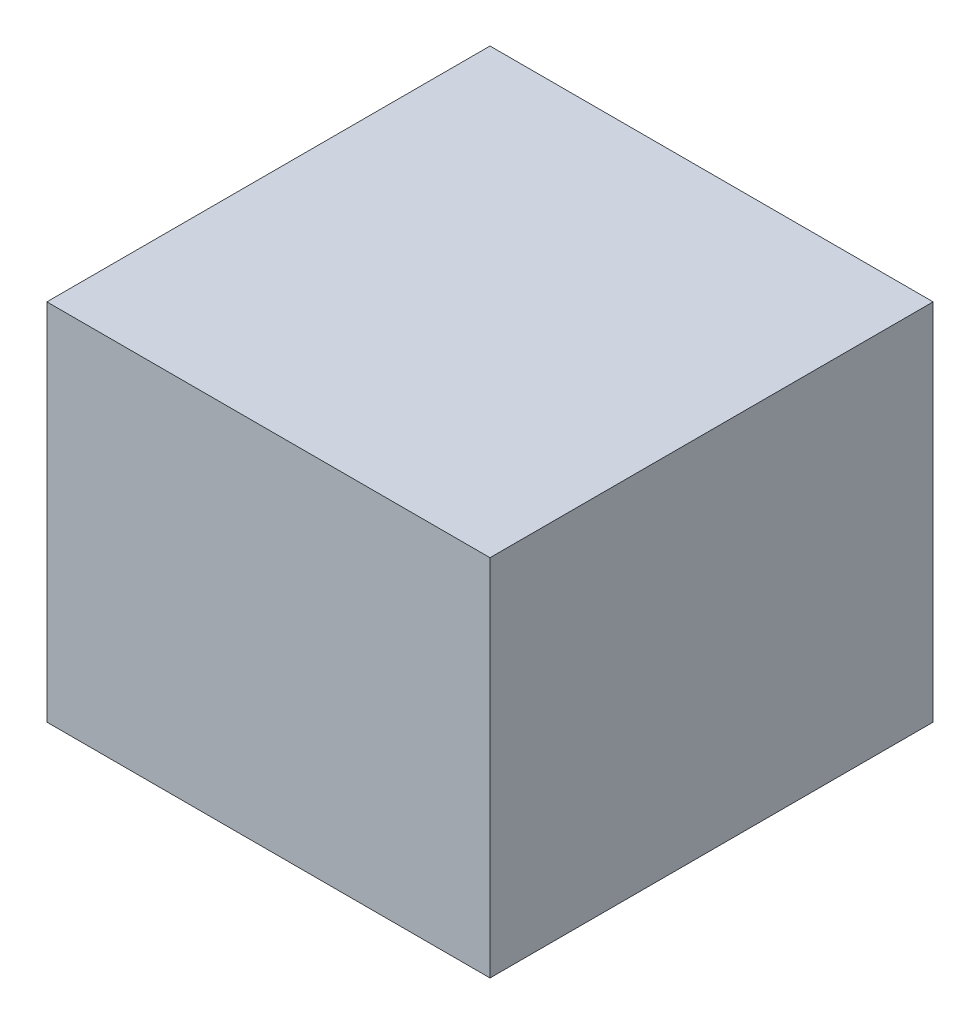
ISO-10303-21;
HEADER;
FILE_DESCRIPTION(('STEP AP214'),'2;1');
FILE_NAME('part.step','',(''),(''),'','','');
FILE_SCHEMA(('AUTOMOTIVE_DESIGN { 1 0 10303 214 1 1 1 1 }'));
ENDSEC;
DATA;
#1=APPLICATION_CONTEXT('core data for automotive mechanical design processes');
#2=APPLICATION_PROTOCOL_DEFINITION('international standard','automotive_design',2000,#1);
#3=PRODUCT_CONTEXT('',#1,'mechanical');
#4=PRODUCT('Part','Part','',(#3));
#5=PRODUCT_RELATED_PRODUCT_CATEGORY('part','',(#4));
#6=PRODUCT_DEFINITION_FORMATION('','',#4);
#7=PRODUCT_DEFINITION_CONTEXT('part definition',#1,'design');
#8=PRODUCT_DEFINITION('design','',#6,#7);
#9=PRODUCT_DEFINITION_SHAPE('','',#8);
#10=(LENGTH_UNIT() NAMED_UNIT(*) SI_UNIT(.MILLI.,.METRE.));
#11=(NAMED_UNIT(*) PLANE_ANGLE_UNIT() SI_UNIT($,.RADIAN.));
#12=(NAMED_UNIT(*) SI_UNIT($,.STERADIAN.) SOLID_ANGLE_UNIT());
#13=UNCERTAINTY_MEASURE_WITH_UNIT(LENGTH_MEASURE(1.E-05),#10,'distance_accuracy_value','');
#14=(GEOMETRIC_REPRESENTATION_CONTEXT(3) GLOBAL_UNCERTAINTY_ASSIGNED_CONTEXT((#13)) GLOBAL_UNIT_ASSIGNED_CONTEXT((#10,
#11,#12)) REPRESENTATION_CONTEXT('',''));
#15=CARTESIAN_POINT('',(0.,0.,0.));
#16=DIRECTION('',(0.,0.,1.));
#17=DIRECTION('',(1.,0.,0.));
#18=AXIS2_PLACEMENT_3D('',#15,#16,#17);
#19=CARTESIAN_POINT('',(70.,57.5,-70.));
#20=DIRECTION('',(-1.,0.,0.));
#21=DIRECTION('',(0.,0.,1.));
#22=AXIS2_PLACEMENT_3D('',#19,#20,#21);
#23=PLANE('',#22);
#24=DIRECTION('',(0.,0.,-1.));
#25=VECTOR('',#24,1.);
#26=CARTESIAN_POINT('',(70.,-57.5,-70.));
#27=LINE('',#26,#25);
#28=CARTESIAN_POINT('',(70.,-57.5,70.));
#29=VERTEX_POINT('',#28);
#30=CARTESIAN_POINT('',(70.,-57.5,-70.));
#31=VERTEX_POINT('',#30);
#32=EDGE_CURVE('E99',#29,#31,#27,.T.);
#33=ORIENTED_EDGE('',*,*,#32,.T.);
#34=DIRECTION('',(0.,-1.,0.));
#35=VECTOR('',#34,1.);
#36=CARTESIAN_POINT('',(70.,57.5,-70.));
#37=LINE('',#36,#35);
#38=CARTESIAN_POINT('',(70.,57.5,-70.));
#39=VERTEX_POINT('',#38);
#40=EDGE_CURVE('E11',#39,#31,#37,.T.);
#41=ORIENTED_EDGE('',*,*,#40,.F.);
#42=DIRECTION('',(0.,0.,-1.));
#43=VECTOR('',#42,1.);
#44=CARTESIAN_POINT('',(70.,57.5,-70.));
#45=LINE('',#44,#43);
#46=CARTESIAN_POINT('',(70.,57.5,70.));
#47=VERTEX_POINT('',#46);
#48=EDGE_CURVE('E87',#47,#39,#45,.T.);
#49=ORIENTED_EDGE('',*,*,#48,.F.);
#50=DIRECTION('',(0.,-1.,0.));
#51=VECTOR('',#50,1.);
#52=CARTESIAN_POINT('',(70.,57.5,70.));
#53=LINE('',#52,#51);
#54=EDGE_CURVE('E95',#47,#29,#53,.T.);
#55=ORIENTED_EDGE('',*,*,#54,.T.);
#56=EDGE_LOOP('',(#33,#41,#49,#55));
#57=FACE_BOUND('',#56,.T.);
#58=ADVANCED_FACE('F36',(#57),#23,.F.);
#59=CARTESIAN_POINT('',(-70.,57.5,-70.));
#60=DIRECTION('',(0.,0.,1.));
#61=DIRECTION('',(1.,0.,0.));
#62=AXIS2_PLACEMENT_3D('',#59,#60,#61);
#63=PLANE('',#62);
#64=DIRECTION('',(-1.,0.,0.));
#65=VECTOR('',#64,1.);
#66=CARTESIAN_POINT('',(-70.,-57.5,-70.));
#67=LINE('',#66,#65);
#68=CARTESIAN_POINT('',(-70.,-57.5,-70.));
#69=VERTEX_POINT('',#68);
#70=EDGE_CURVE('E91',#31,#69,#67,.T.);
#71=ORIENTED_EDGE('',*,*,#70,.T.);
#72=DIRECTION('',(0.,-1.,0.));
#73=VECTOR('',#72,1.);
#74=CARTESIAN_POINT('',(-70.,57.5,-70.));
#75=LINE('',#74,#73);
#76=CARTESIAN_POINT('',(-70.,57.5,-70.));
#77=VERTEX_POINT('',#76);
#78=EDGE_CURVE('E44',#77,#69,#75,.T.);
#79=ORIENTED_EDGE('',*,*,#78,.F.);
#80=DIRECTION('',(-1.,0.,0.));
#81=VECTOR('',#80,1.);
#82=CARTESIAN_POINT('',(-70.,57.5,-70.));
#83=LINE('',#82,#81);
#84=EDGE_CURVE('E82',#39,#77,#83,.T.);
#85=ORIENTED_EDGE('',*,*,#84,.F.);
#86=ORIENTED_EDGE('',*,*,#40,.T.);
#87=EDGE_LOOP('',(#71,#79,#85,#86));
#88=FACE_BOUND('',#87,.T.);
#89=ADVANCED_FACE('F90',(#88),#63,.F.);
#90=CARTESIAN_POINT('',(-70.,57.5,-70.));
#91=DIRECTION('',(1.,0.,0.));
#92=DIRECTION('',(0.,0.,-1.));
#93=AXIS2_PLACEMENT_3D('',#90,#91,#92);
#94=PLANE('',#93);
#95=DIRECTION('',(0.,0.,1.));
#96=VECTOR('',#95,1.);
#97=CARTESIAN_POINT('',(-70.,-57.5,-70.));
#98=LINE('',#97,#96);
#99=CARTESIAN_POINT('',(-70.,-57.5,70.));
#100=VERTEX_POINT('',#99);
#101=EDGE_CURVE('E69',#69,#100,#98,.T.);
#102=ORIENTED_EDGE('',*,*,#101,.T.);
#103=DIRECTION('',(0.,-1.,0.));
#104=VECTOR('',#103,1.);
#105=CARTESIAN_POINT('',(-70.,57.5,70.));
#106=LINE('',#105,#104);
#107=CARTESIAN_POINT('',(-70.,57.5,70.));
#108=VERTEX_POINT('',#107);
#109=EDGE_CURVE('E92',#108,#100,#106,.T.);
#110=ORIENTED_EDGE('',*,*,#109,.F.);
#111=DIRECTION('',(0.,0.,1.));
#112=VECTOR('',#111,1.);
#113=CARTESIAN_POINT('',(-70.,57.5,-70.));
#114=LINE('',#113,#112);
#115=EDGE_CURVE('E85',#77,#108,#114,.T.);
#116=ORIENTED_EDGE('',*,*,#115,.F.);
#117=ORIENTED_EDGE('',*,*,#78,.T.);
#118=EDGE_LOOP('',(#102,#110,#116,#117));
#119=FACE_BOUND('',#118,.T.);
#120=ADVANCED_FACE('F93',(#119),#94,.F.);
#121=CARTESIAN_POINT('',(-70.,57.5,70.));
#122=DIRECTION('',(0.,0.,-1.));
#123=DIRECTION('',(-1.,0.,0.));
#124=AXIS2_PLACEMENT_3D('',#121,#122,#123);
#125=PLANE('',#124);
#126=DIRECTION('',(1.,0.,0.));
#127=VECTOR('',#126,1.);
#128=CARTESIAN_POINT('',(-70.,-57.5,70.));
#129=LINE('',#128,#127);
#130=EDGE_CURVE('E75',#100,#29,#129,.T.);
#131=ORIENTED_EDGE('',*,*,#130,.T.);
#132=ORIENTED_EDGE('',*,*,#54,.F.);
#133=DIRECTION('',(1.,0.,0.));
#134=VECTOR('',#133,1.);
#135=CARTESIAN_POINT('',(-70.,57.5,70.));
#136=LINE('',#135,#134);
#137=EDGE_CURVE('E52',#108,#47,#136,.T.);
#138=ORIENTED_EDGE('',*,*,#137,.F.);
#139=ORIENTED_EDGE('',*,*,#109,.T.);
#140=EDGE_LOOP('',(#131,#132,#138,#139));
#141=FACE_BOUND('',#140,.T.);
#142=ADVANCED_FACE('F106',(#141),#125,.F.);
#143=CARTESIAN_POINT('',(0.,57.5,0.));
#144=DIRECTION('',(0.,1.,0.));
#145=DIRECTION('',(0.,0.,1.));
#146=AXIS2_PLACEMENT_3D('',#143,#144,#145);
#147=PLANE('',#146);
#148=ORIENTED_EDGE('',*,*,#48,.T.);
#149=ORIENTED_EDGE('',*,*,#84,.T.);
#150=ORIENTED_EDGE('',*,*,#115,.T.);
#151=ORIENTED_EDGE('',*,*,#137,.T.);
#152=EDGE_LOOP('',(#148,#149,#150,#151));
#153=FACE_BOUND('',#152,.T.);
#154=ADVANCED_FACE('F83',(#153),#147,.T.);
#155=CARTESIAN_POINT('',(0.,-57.5,0.));
#156=DIRECTION('',(0.,1.,0.));
#157=DIRECTION('',(0.,0.,1.));
#158=AXIS2_PLACEMENT_3D('',#155,#156,#157);
#159=PLANE('',#158);
#160=ORIENTED_EDGE('',*,*,#32,.F.);
#161=ORIENTED_EDGE('',*,*,#130,.F.);
#162=ORIENTED_EDGE('',*,*,#101,.F.);
#163=ORIENTED_EDGE('',*,*,#70,.F.);
#164=EDGE_LOOP('',(#160,#161,#162,#163));
#165=FACE_BOUND('',#164,.T.);
#166=ADVANCED_FACE('F109',(#165),#159,.F.);
#167=CLOSED_SHELL('',(#58,#89,#120,#142,#154,#166));
#168=MANIFOLD_SOLID_BREP('B2',#167);
#169=ADVANCED_BREP_SHAPE_REPRESENTATION('',(#18,#168),#14);
#170=SHAPE_DEFINITION_REPRESENTATION(#9,#169);
ENDSEC;
END-ISO-10303-21;
